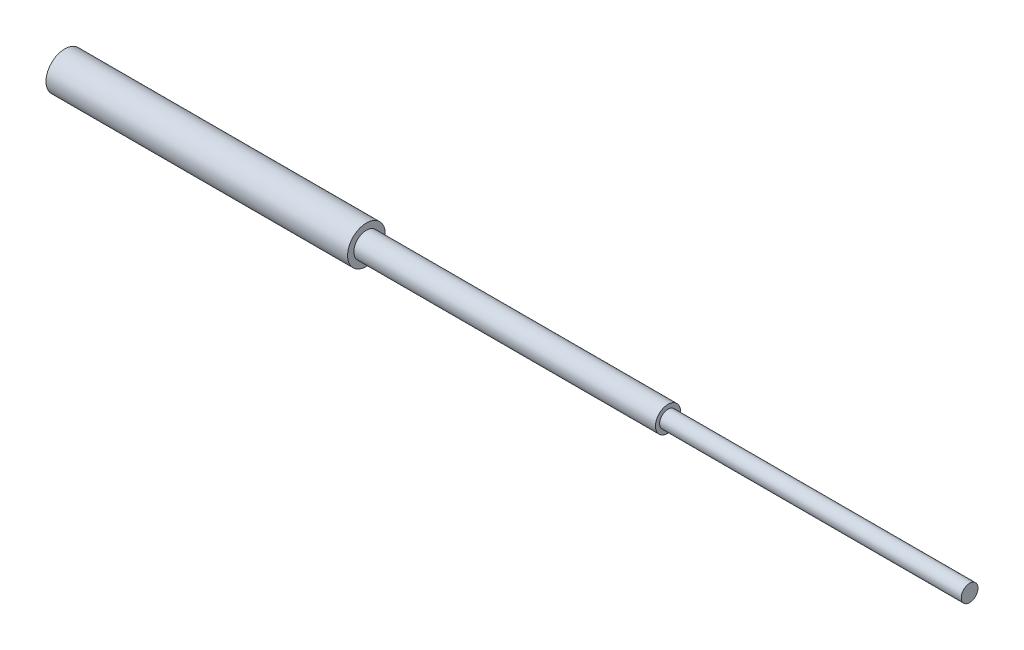
ISO-10303-21;
HEADER;
FILE_DESCRIPTION(('STEP AP214'),'2;1');
FILE_NAME('part.step','',(''),(''),'','','');
FILE_SCHEMA(('AUTOMOTIVE_DESIGN { 1 0 10303 214 1 1 1 1 }'));
ENDSEC;
DATA;
#1=APPLICATION_CONTEXT('core data for automotive mechanical design processes');
#2=APPLICATION_PROTOCOL_DEFINITION('international standard','automotive_design',2000,#1);
#3=PRODUCT_CONTEXT('',#1,'mechanical');
#4=PRODUCT('Part','Part','',(#3));
#5=PRODUCT_RELATED_PRODUCT_CATEGORY('part','',(#4));
#6=PRODUCT_DEFINITION_FORMATION('','',#4);
#7=PRODUCT_DEFINITION_CONTEXT('part definition',#1,'design');
#8=PRODUCT_DEFINITION('design','',#6,#7);
#9=PRODUCT_DEFINITION_SHAPE('','',#8);
#10=(LENGTH_UNIT() NAMED_UNIT(*) SI_UNIT(.MILLI.,.METRE.));
#11=(NAMED_UNIT(*) PLANE_ANGLE_UNIT() SI_UNIT($,.RADIAN.));
#12=(NAMED_UNIT(*) SI_UNIT($,.STERADIAN.) SOLID_ANGLE_UNIT());
#13=UNCERTAINTY_MEASURE_WITH_UNIT(LENGTH_MEASURE(1.E-05),#10,'distance_accuracy_value','');
#14=(GEOMETRIC_REPRESENTATION_CONTEXT(3) GLOBAL_UNCERTAINTY_ASSIGNED_CONTEXT((#13)) GLOBAL_UNIT_ASSIGNED_CONTEXT((#10,
#11,#12)) REPRESENTATION_CONTEXT('',''));
#15=CARTESIAN_POINT('',(0.,0.,0.));
#16=DIRECTION('',(0.,0.,1.));
#17=DIRECTION('',(1.,0.,0.));
#18=AXIS2_PLACEMENT_3D('',#15,#16,#17);
#19=CARTESIAN_POINT('',(914.4,0.,0.));
#20=DIRECTION('',(1.,0.,0.));
#21=DIRECTION('',(0.,0.,-1.));
#22=AXIS2_PLACEMENT_3D('',#19,#20,#21);
#23=PLANE('',#22);
#24=CARTESIAN_POINT('',(914.4,0.,0.));
#25=DIRECTION('',(1.,0.,0.));
#26=DIRECTION('',(0.,0.,-1.));
#27=AXIS2_PLACEMENT_3D('',#24,#25,#26);
#28=CIRCLE('',#27,19.05);
#29=CARTESIAN_POINT('',(914.4,0.,-19.05));
#30=VERTEX_POINT('',#29);
#31=EDGE_CURVE('E46',#30,#30,#28,.T.);
#32=ORIENTED_EDGE('',*,*,#31,.T.);
#33=EDGE_LOOP('',(#32));
#34=FACE_BOUND('',#33,.T.);
#35=CARTESIAN_POINT('',(914.4,0.,0.));
#36=DIRECTION('',(1.,0.,0.));
#37=DIRECTION('',(0.,0.,-1.));
#38=AXIS2_PLACEMENT_3D('',#35,#36,#37);
#39=CIRCLE('',#38,12.7);
#40=CARTESIAN_POINT('',(914.4,0.,-12.7));
#41=VERTEX_POINT('',#40);
#42=EDGE_CURVE('E54',#41,#41,#39,.T.);
#43=ORIENTED_EDGE('',*,*,#42,.F.);
#44=EDGE_LOOP('',(#43));
#45=FACE_BOUND('',#44,.T.);
#46=ADVANCED_FACE('F35',(#34,#45),#23,.T.);
#47=CARTESIAN_POINT('',(457.2,0.,0.));
#48=DIRECTION('',(1.,0.,0.));
#49=DIRECTION('',(0.,0.,-1.));
#50=AXIS2_PLACEMENT_3D('',#47,#48,#49);
#51=PLANE('',#50);
#52=CARTESIAN_POINT('',(457.2,0.,0.));
#53=DIRECTION('',(1.,0.,0.));
#54=DIRECTION('',(0.,0.,-1.));
#55=AXIS2_PLACEMENT_3D('',#52,#53,#54);
#56=CIRCLE('',#55,28.575);
#57=CARTESIAN_POINT('',(457.2,0.,-28.575));
#58=VERTEX_POINT('',#57);
#59=EDGE_CURVE('E10',#58,#58,#56,.T.);
#60=ORIENTED_EDGE('',*,*,#59,.T.);
#61=EDGE_LOOP('',(#60));
#62=FACE_BOUND('',#61,.T.);
#63=CARTESIAN_POINT('',(457.2,0.,0.));
#64=DIRECTION('',(1.,0.,0.));
#65=DIRECTION('',(0.,0.,-1.));
#66=AXIS2_PLACEMENT_3D('',#63,#64,#65);
#67=CIRCLE('',#66,19.05);
#68=CARTESIAN_POINT('',(457.2,0.,-19.05));
#69=VERTEX_POINT('',#68);
#70=EDGE_CURVE('E48',#69,#69,#67,.T.);
#71=ORIENTED_EDGE('',*,*,#70,.F.);
#72=EDGE_LOOP('',(#71));
#73=FACE_BOUND('',#72,.T.);
#74=ADVANCED_FACE('F70',(#62,#73),#51,.T.);
#75=CARTESIAN_POINT('',(457.2,0.,0.));
#76=DIRECTION('',(-1.,0.,0.));
#77=DIRECTION('',(0.,0.,1.));
#78=AXIS2_PLACEMENT_3D('',#75,#76,#77);
#79=CYLINDRICAL_SURFACE('',#78,28.575);
#80=ORIENTED_EDGE('',*,*,#59,.F.);
#81=EDGE_LOOP('',(#80));
#82=FACE_BOUND('',#81,.T.);
#83=CARTESIAN_POINT('',(0.,0.,0.));
#84=DIRECTION('',(1.,0.,0.));
#85=DIRECTION('',(0.,0.,-1.));
#86=AXIS2_PLACEMENT_3D('',#83,#84,#85);
#87=CIRCLE('',#86,28.575);
#88=CARTESIAN_POINT('',(0.,0.,-28.575));
#89=VERTEX_POINT('',#88);
#90=EDGE_CURVE('E39',#89,#89,#87,.T.);
#91=ORIENTED_EDGE('',*,*,#90,.T.);
#92=EDGE_LOOP('',(#91));
#93=FACE_BOUND('',#92,.T.);
#94=ADVANCED_FACE('F37',(#82,#93),#79,.T.);
#95=CARTESIAN_POINT('',(0.,0.,0.));
#96=DIRECTION('',(1.,0.,0.));
#97=DIRECTION('',(0.,0.,-1.));
#98=AXIS2_PLACEMENT_3D('',#95,#96,#97);
#99=PLANE('',#98);
#100=ORIENTED_EDGE('',*,*,#90,.F.);
#101=EDGE_LOOP('',(#100));
#102=FACE_BOUND('',#101,.T.);
#103=ADVANCED_FACE('F80',(#102),#99,.F.);
#104=CARTESIAN_POINT('',(914.4,0.,0.));
#105=DIRECTION('',(-1.,0.,0.));
#106=DIRECTION('',(0.,0.,1.));
#107=AXIS2_PLACEMENT_3D('',#104,#105,#106);
#108=CYLINDRICAL_SURFACE('',#107,19.05);
#109=ORIENTED_EDGE('',*,*,#31,.F.);
#110=EDGE_LOOP('',(#109));
#111=FACE_BOUND('',#110,.T.);
#112=ORIENTED_EDGE('',*,*,#70,.T.);
#113=EDGE_LOOP('',(#112));
#114=FACE_BOUND('',#113,.T.);
#115=ADVANCED_FACE('F65',(#111,#114),#108,.T.);
#116=CARTESIAN_POINT('',(1371.6,0.,0.));
#117=DIRECTION('',(-1.,0.,0.));
#118=DIRECTION('',(0.,0.,1.));
#119=AXIS2_PLACEMENT_3D('',#116,#117,#118);
#120=CYLINDRICAL_SURFACE('',#119,12.7);
#121=CARTESIAN_POINT('',(1371.6,0.,0.));
#122=DIRECTION('',(1.,0.,0.));
#123=DIRECTION('',(0.,0.,-1.));
#124=AXIS2_PLACEMENT_3D('',#121,#122,#123);
#125=CIRCLE('',#124,12.7);
#126=CARTESIAN_POINT('',(1371.6,0.,-12.7));
#127=VERTEX_POINT('',#126);
#128=EDGE_CURVE('E51',#127,#127,#125,.T.);
#129=ORIENTED_EDGE('',*,*,#128,.F.);
#130=EDGE_LOOP('',(#129));
#131=FACE_BOUND('',#130,.T.);
#132=ORIENTED_EDGE('',*,*,#42,.T.);
#133=EDGE_LOOP('',(#132));
#134=FACE_BOUND('',#133,.T.);
#135=ADVANCED_FACE('F62',(#131,#134),#120,.T.);
#136=CARTESIAN_POINT('',(1371.6,0.,0.));
#137=DIRECTION('',(1.,0.,0.));
#138=DIRECTION('',(0.,0.,-1.));
#139=AXIS2_PLACEMENT_3D('',#136,#137,#138);
#140=PLANE('',#139);
#141=ORIENTED_EDGE('',*,*,#128,.T.);
#142=EDGE_LOOP('',(#141));
#143=FACE_BOUND('',#142,.T.);
#144=ADVANCED_FACE('F60',(#143),#140,.T.);
#145=CLOSED_SHELL('',(#46,#74,#94,#103,#115,#135,#144));
#146=MANIFOLD_SOLID_BREP('B2',#145);
#147=ADVANCED_BREP_SHAPE_REPRESENTATION('',(#18,#146),#14);
#148=SHAPE_DEFINITION_REPRESENTATION(#9,#147);
ENDSEC;
END-ISO-10303-21;
